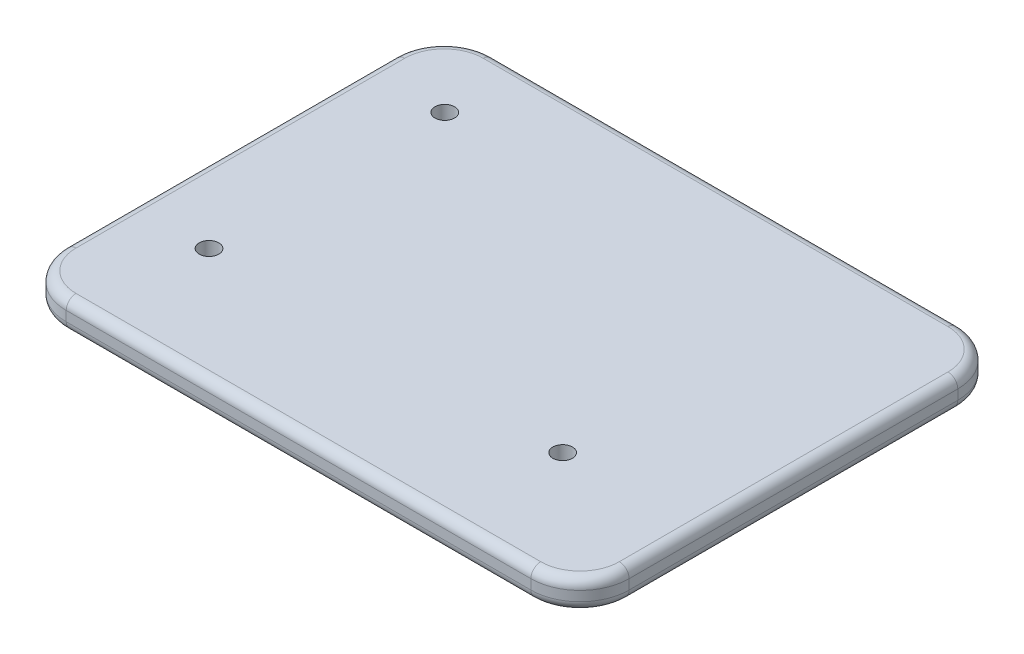
ISO-10303-21;
HEADER;
FILE_DESCRIPTION(('STEP AP214'),'2;1');
FILE_NAME('part.step','',(''),(''),'','','');
FILE_SCHEMA(('AUTOMOTIVE_DESIGN { 1 0 10303 214 1 1 1 1 }'));
ENDSEC;
DATA;
#1=APPLICATION_CONTEXT('core data for automotive mechanical design processes');
#2=APPLICATION_PROTOCOL_DEFINITION('international standard','automotive_design',2000,#1);
#3=PRODUCT_CONTEXT('',#1,'mechanical');
#4=PRODUCT('Part','Part','',(#3));
#5=PRODUCT_RELATED_PRODUCT_CATEGORY('part','',(#4));
#6=PRODUCT_DEFINITION_FORMATION('','',#4);
#7=PRODUCT_DEFINITION_CONTEXT('part definition',#1,'design');
#8=PRODUCT_DEFINITION('design','',#6,#7);
#9=PRODUCT_DEFINITION_SHAPE('','',#8);
#10=(LENGTH_UNIT() NAMED_UNIT(*) SI_UNIT(.MILLI.,.METRE.));
#11=(NAMED_UNIT(*) PLANE_ANGLE_UNIT() SI_UNIT($,.RADIAN.));
#12=(NAMED_UNIT(*) SI_UNIT($,.STERADIAN.) SOLID_ANGLE_UNIT());
#13=UNCERTAINTY_MEASURE_WITH_UNIT(LENGTH_MEASURE(1.E-05),#10,'distance_accuracy_value','');
#14=(GEOMETRIC_REPRESENTATION_CONTEXT(3) GLOBAL_UNCERTAINTY_ASSIGNED_CONTEXT((#13)) GLOBAL_UNIT_ASSIGNED_CONTEXT((#10,
#11,#12)) REPRESENTATION_CONTEXT('',''));
#15=CARTESIAN_POINT('',(0.,0.,0.));
#16=DIRECTION('',(0.,0.,1.));
#17=DIRECTION('',(1.,0.,0.));
#18=AXIS2_PLACEMENT_3D('',#15,#16,#17);
#19=CARTESIAN_POINT('',(26.655,3.,18.23));
#20=DIRECTION('',(0.,1.,0.));
#21=DIRECTION('',(0.,0.,1.));
#22=AXIS2_PLACEMENT_3D('',#19,#20,#21);
#23=PLANE('',#22);
#24=DIRECTION('',(-1.,0.,0.));
#25=VECTOR('',#24,1.);
#26=CARTESIAN_POINT('',(-20.655,3.,-19.23));
#27=LINE('',#26,#25);
#28=CARTESIAN_POINT('',(26.655,3.,-19.23));
#29=VERTEX_POINT('',#28);
#30=CARTESIAN_POINT('',(-20.655,3.,-19.23));
#31=VERTEX_POINT('',#30);
#32=EDGE_CURVE('E50',#29,#31,#27,.T.);
#33=ORIENTED_EDGE('',*,*,#32,.T.);
#34=CARTESIAN_POINT('',(-20.655,3.,-15.23));
#35=DIRECTION('',(0.,1.,0.));
#36=DIRECTION('',(0.,0.,1.));
#37=AXIS2_PLACEMENT_3D('',#34,#35,#36);
#38=CIRCLE('',#37,4.);
#39=CARTESIAN_POINT('',(-24.655,3.,-15.23));
#40=VERTEX_POINT('',#39);
#41=EDGE_CURVE('E157',#31,#40,#38,.T.);
#42=ORIENTED_EDGE('',*,*,#41,.T.);
#43=DIRECTION('',(0.,0.,1.));
#44=VECTOR('',#43,1.);
#45=CARTESIAN_POINT('',(-24.655,3.,18.23));
#46=LINE('',#45,#44);
#47=CARTESIAN_POINT('',(-24.655,3.,18.23));
#48=VERTEX_POINT('',#47);
#49=EDGE_CURVE('E181',#40,#48,#46,.T.);
#50=ORIENTED_EDGE('',*,*,#49,.T.);
#51=CARTESIAN_POINT('',(-20.655,3.,18.23));
#52=DIRECTION('',(0.,1.,0.));
#53=DIRECTION('',(0.,0.,1.));
#54=AXIS2_PLACEMENT_3D('',#51,#52,#53);
#55=CIRCLE('',#54,4.);
#56=CARTESIAN_POINT('',(-20.655,3.,22.23));
#57=VERTEX_POINT('',#56);
#58=EDGE_CURVE('E320',#48,#57,#55,.T.);
#59=ORIENTED_EDGE('',*,*,#58,.T.);
#60=DIRECTION('',(1.,0.,0.));
#61=VECTOR('',#60,1.);
#62=CARTESIAN_POINT('',(26.655,3.,22.23));
#63=LINE('',#62,#61);
#64=CARTESIAN_POINT('',(26.655,3.,22.23));
#65=VERTEX_POINT('',#64);
#66=EDGE_CURVE('E322',#57,#65,#63,.T.);
#67=ORIENTED_EDGE('',*,*,#66,.T.);
#68=CARTESIAN_POINT('',(26.655,3.,18.23));
#69=DIRECTION('',(0.,1.,0.));
#70=DIRECTION('',(0.,0.,1.));
#71=AXIS2_PLACEMENT_3D('',#68,#69,#70);
#72=CIRCLE('',#71,4.);
#73=CARTESIAN_POINT('',(30.655,3.,18.23));
#74=VERTEX_POINT('',#73);
#75=EDGE_CURVE('E324',#65,#74,#72,.T.);
#76=ORIENTED_EDGE('',*,*,#75,.T.);
#77=DIRECTION('',(0.,0.,-1.));
#78=VECTOR('',#77,1.);
#79=CARTESIAN_POINT('',(30.655,3.,-15.23));
#80=LINE('',#79,#78);
#81=CARTESIAN_POINT('',(30.655,3.,-15.23));
#82=VERTEX_POINT('',#81);
#83=EDGE_CURVE('E326',#74,#82,#80,.T.);
#84=ORIENTED_EDGE('',*,*,#83,.T.);
#85=CARTESIAN_POINT('',(26.655,3.,-15.23));
#86=DIRECTION('',(0.,1.,0.));
#87=DIRECTION('',(0.,0.,1.));
#88=AXIS2_PLACEMENT_3D('',#85,#86,#87);
#89=CIRCLE('',#88,4.);
#90=EDGE_CURVE('E55',#82,#29,#89,.T.);
#91=ORIENTED_EDGE('',*,*,#90,.T.);
#92=EDGE_LOOP('',(#33,#42,#50,#59,#67,#76,#84,#91));
#93=FACE_BOUND('',#92,.T.);
#94=CARTESIAN_POINT('',(-17.845,3.,11.5));
#95=DIRECTION('',(0.,1.,0.));
#96=DIRECTION('',(0.,0.,1.));
#97=AXIS2_PLACEMENT_3D('',#94,#95,#96);
#98=CIRCLE('',#97,1.);
#99=CARTESIAN_POINT('',(-17.845,3.,12.5));
#100=VERTEX_POINT('',#99);
#101=EDGE_CURVE('E250',#100,#100,#98,.T.);
#102=ORIENTED_EDGE('',*,*,#101,.F.);
#103=EDGE_LOOP('',(#102));
#104=FACE_BOUND('',#103,.T.);
#105=CARTESIAN_POINT('',(18.155,3.,11.5));
#106=DIRECTION('',(0.,1.,0.));
#107=DIRECTION('',(0.,0.,1.));
#108=AXIS2_PLACEMENT_3D('',#105,#106,#107);
#109=CIRCLE('',#108,1.);
#110=CARTESIAN_POINT('',(18.155,3.,12.5));
#111=VERTEX_POINT('',#110);
#112=EDGE_CURVE('E256',#111,#111,#109,.T.);
#113=ORIENTED_EDGE('',*,*,#112,.F.);
#114=EDGE_LOOP('',(#113));
#115=FACE_BOUND('',#114,.T.);
#116=CARTESIAN_POINT('',(-17.845,3.,-12.5));
#117=DIRECTION('',(0.,1.,0.));
#118=DIRECTION('',(0.,0.,1.));
#119=AXIS2_PLACEMENT_3D('',#116,#117,#118);
#120=CIRCLE('',#119,1.);
#121=CARTESIAN_POINT('',(-17.845,3.,-11.5));
#122=VERTEX_POINT('',#121);
#123=EDGE_CURVE('E242',#122,#122,#120,.T.);
#124=ORIENTED_EDGE('',*,*,#123,.F.);
#125=EDGE_LOOP('',(#124));
#126=FACE_BOUND('',#125,.T.);
#127=ADVANCED_FACE('F33',(#93,#104,#115,#126),#23,.T.);
#128=CARTESIAN_POINT('',(26.655,0.,18.23));
#129=DIRECTION('',(0.,1.,0.));
#130=DIRECTION('',(0.,0.,1.));
#131=AXIS2_PLACEMENT_3D('',#128,#129,#130);
#132=PLANE('',#131);
#133=DIRECTION('',(0.,0.,1.));
#134=VECTOR('',#133,1.);
#135=CARTESIAN_POINT('',(-24.655,0.,18.23));
#136=LINE('',#135,#134);
#137=CARTESIAN_POINT('',(-24.655,0.,18.23));
#138=VERTEX_POINT('',#137);
#139=CARTESIAN_POINT('',(-24.655,0.,-15.23));
#140=VERTEX_POINT('',#139);
#141=EDGE_CURVE('E278',#138,#140,#136,.F.);
#142=ORIENTED_EDGE('',*,*,#141,.T.);
#143=CARTESIAN_POINT('',(-20.655,0.,-15.23));
#144=DIRECTION('',(0.,1.,0.));
#145=DIRECTION('',(0.,0.,1.));
#146=AXIS2_PLACEMENT_3D('',#143,#144,#145);
#147=CIRCLE('',#146,4.);
#148=CARTESIAN_POINT('',(-20.655,0.,-19.23));
#149=VERTEX_POINT('',#148);
#150=EDGE_CURVE('E292',#140,#149,#147,.F.);
#151=ORIENTED_EDGE('',*,*,#150,.T.);
#152=DIRECTION('',(-1.,0.,0.));
#153=VECTOR('',#152,1.);
#154=CARTESIAN_POINT('',(26.655,0.,-19.23));
#155=LINE('',#154,#153);
#156=CARTESIAN_POINT('',(26.655,0.,-19.23));
#157=VERTEX_POINT('',#156);
#158=EDGE_CURVE('E290',#149,#157,#155,.F.);
#159=ORIENTED_EDGE('',*,*,#158,.T.);
#160=CARTESIAN_POINT('',(26.655,0.,-15.23));
#161=DIRECTION('',(0.,1.,0.));
#162=DIRECTION('',(0.,0.,1.));
#163=AXIS2_PLACEMENT_3D('',#160,#161,#162);
#164=CIRCLE('',#163,4.);
#165=CARTESIAN_POINT('',(30.655,0.,-15.23));
#166=VERTEX_POINT('',#165);
#167=EDGE_CURVE('E288',#157,#166,#164,.F.);
#168=ORIENTED_EDGE('',*,*,#167,.T.);
#169=DIRECTION('',(0.,0.,-1.));
#170=VECTOR('',#169,1.);
#171=CARTESIAN_POINT('',(30.655,0.,18.23));
#172=LINE('',#171,#170);
#173=CARTESIAN_POINT('',(30.655,0.,18.23));
#174=VERTEX_POINT('',#173);
#175=EDGE_CURVE('E286',#166,#174,#172,.F.);
#176=ORIENTED_EDGE('',*,*,#175,.T.);
#177=CARTESIAN_POINT('',(26.655,0.,18.23));
#178=DIRECTION('',(0.,1.,0.));
#179=DIRECTION('',(0.,0.,1.));
#180=AXIS2_PLACEMENT_3D('',#177,#178,#179);
#181=CIRCLE('',#180,4.);
#182=CARTESIAN_POINT('',(26.655,0.,22.23));
#183=VERTEX_POINT('',#182);
#184=EDGE_CURVE('E284',#174,#183,#181,.F.);
#185=ORIENTED_EDGE('',*,*,#184,.T.);
#186=DIRECTION('',(1.,0.,0.));
#187=VECTOR('',#186,1.);
#188=CARTESIAN_POINT('',(26.655,0.,22.23));
#189=LINE('',#188,#187);
#190=CARTESIAN_POINT('',(-20.655,0.,22.23));
#191=VERTEX_POINT('',#190);
#192=EDGE_CURVE('E282',#183,#191,#189,.F.);
#193=ORIENTED_EDGE('',*,*,#192,.T.);
#194=CARTESIAN_POINT('',(-20.655,0.,18.23));
#195=DIRECTION('',(0.,1.,0.));
#196=DIRECTION('',(0.,0.,1.));
#197=AXIS2_PLACEMENT_3D('',#194,#195,#196);
#198=CIRCLE('',#197,4.);
#199=EDGE_CURVE('E280',#191,#138,#198,.F.);
#200=ORIENTED_EDGE('',*,*,#199,.T.);
#201=EDGE_LOOP('',(#142,#151,#159,#168,#176,#185,#193,#200));
#202=FACE_BOUND('',#201,.T.);
#203=CARTESIAN_POINT('',(18.155,0.,11.5));
#204=DIRECTION('',(0.,1.,0.));
#205=DIRECTION('',(0.,0.,1.));
#206=AXIS2_PLACEMENT_3D('',#203,#204,#205);
#207=CIRCLE('',#206,1.);
#208=CARTESIAN_POINT('',(18.155,0.,12.5));
#209=VERTEX_POINT('',#208);
#210=EDGE_CURVE('E253',#209,#209,#207,.T.);
#211=ORIENTED_EDGE('',*,*,#210,.T.);
#212=EDGE_LOOP('',(#211));
#213=FACE_BOUND('',#212,.T.);
#214=CARTESIAN_POINT('',(-17.845,0.,11.5));
#215=DIRECTION('',(0.,1.,0.));
#216=DIRECTION('',(0.,0.,1.));
#217=AXIS2_PLACEMENT_3D('',#214,#215,#216);
#218=CIRCLE('',#217,1.);
#219=CARTESIAN_POINT('',(-17.845,0.,12.5));
#220=VERTEX_POINT('',#219);
#221=EDGE_CURVE('E247',#220,#220,#218,.T.);
#222=ORIENTED_EDGE('',*,*,#221,.T.);
#223=EDGE_LOOP('',(#222));
#224=FACE_BOUND('',#223,.T.);
#225=CARTESIAN_POINT('',(-17.845,0.,-12.5));
#226=DIRECTION('',(0.,1.,0.));
#227=DIRECTION('',(0.,0.,1.));
#228=AXIS2_PLACEMENT_3D('',#225,#226,#227);
#229=CIRCLE('',#228,1.);
#230=CARTESIAN_POINT('',(-17.845,0.,-11.5));
#231=VERTEX_POINT('',#230);
#232=EDGE_CURVE('E236',#231,#231,#229,.T.);
#233=ORIENTED_EDGE('',*,*,#232,.T.);
#234=EDGE_LOOP('',(#233));
#235=FACE_BOUND('',#234,.T.);
#236=ADVANCED_FACE('F376',(#202,#213,#224,#235),#132,.F.);
#237=CARTESIAN_POINT('',(26.655,3.,18.23));
#238=DIRECTION('',(0.,-1.,0.));
#239=DIRECTION('',(0.,0.,-1.));
#240=AXIS2_PLACEMENT_3D('',#237,#238,#239);
#241=CYLINDRICAL_SURFACE('',#240,5.);
#242=DIRECTION('',(0.,-1.,0.));
#243=VECTOR('',#242,1.);
#244=CARTESIAN_POINT('',(26.655,3.,23.23));
#245=LINE('',#244,#243);
#246=CARTESIAN_POINT('',(26.655,2.,23.23));
#247=VERTEX_POINT('',#246);
#248=CARTESIAN_POINT('',(26.655,1.,23.23));
#249=VERTEX_POINT('',#248);
#250=EDGE_CURVE('E259',#247,#249,#245,.T.);
#251=ORIENTED_EDGE('',*,*,#250,.T.);
#252=CARTESIAN_POINT('',(26.655,1.,18.23));
#253=DIRECTION('',(0.,1.,0.));
#254=DIRECTION('',(0.,0.,1.));
#255=AXIS2_PLACEMENT_3D('',#252,#253,#254);
#256=CIRCLE('',#255,5.);
#257=CARTESIAN_POINT('',(31.655,1.,18.23));
#258=VERTEX_POINT('',#257);
#259=EDGE_CURVE('E309',#249,#258,#256,.T.);
#260=ORIENTED_EDGE('',*,*,#259,.T.);
#261=DIRECTION('',(0.,-1.,0.));
#262=VECTOR('',#261,1.);
#263=CARTESIAN_POINT('',(31.655,3.,18.23));
#264=LINE('',#263,#262);
#265=CARTESIAN_POINT('',(31.655,2.,18.23));
#266=VERTEX_POINT('',#265);
#267=EDGE_CURVE('E178',#266,#258,#264,.T.);
#268=ORIENTED_EDGE('',*,*,#267,.F.);
#269=CARTESIAN_POINT('',(26.655,2.,18.23));
#270=DIRECTION('',(0.,1.,0.));
#271=DIRECTION('',(0.,0.,1.));
#272=AXIS2_PLACEMENT_3D('',#269,#270,#271);
#273=CIRCLE('',#272,5.);
#274=EDGE_CURVE('E307',#266,#247,#273,.F.);
#275=ORIENTED_EDGE('',*,*,#274,.T.);
#276=EDGE_LOOP('',(#251,#260,#268,#275));
#277=FACE_BOUND('',#276,.T.);
#278=ADVANCED_FACE('F381',(#277),#241,.T.);
#279=CARTESIAN_POINT('',(31.655,3.,18.23));
#280=DIRECTION('',(-1.,0.,0.));
#281=DIRECTION('',(0.,0.,1.));
#282=AXIS2_PLACEMENT_3D('',#279,#280,#281);
#283=PLANE('',#282);
#284=ORIENTED_EDGE('',*,*,#267,.T.);
#285=DIRECTION('',(0.,0.,-1.));
#286=VECTOR('',#285,1.);
#287=CARTESIAN_POINT('',(31.655,1.,18.23));
#288=LINE('',#287,#286);
#289=CARTESIAN_POINT('',(31.655,1.,-15.23));
#290=VERTEX_POINT('',#289);
#291=EDGE_CURVE('E305',#258,#290,#288,.T.);
#292=ORIENTED_EDGE('',*,*,#291,.T.);
#293=DIRECTION('',(0.,-1.,0.));
#294=VECTOR('',#293,1.);
#295=CARTESIAN_POINT('',(31.655,3.,-15.23));
#296=LINE('',#295,#294);
#297=CARTESIAN_POINT('',(31.655,2.,-15.23));
#298=VERTEX_POINT('',#297);
#299=EDGE_CURVE('E272',#298,#290,#296,.T.);
#300=ORIENTED_EDGE('',*,*,#299,.F.);
#301=DIRECTION('',(0.,0.,-1.));
#302=VECTOR('',#301,1.);
#303=CARTESIAN_POINT('',(31.655,2.,18.23));
#304=LINE('',#303,#302);
#305=EDGE_CURVE('E303',#298,#266,#304,.F.);
#306=ORIENTED_EDGE('',*,*,#305,.T.);
#307=EDGE_LOOP('',(#284,#292,#300,#306));
#308=FACE_BOUND('',#307,.T.);
#309=ADVANCED_FACE('F404',(#308),#283,.F.);
#310=CARTESIAN_POINT('',(26.655,3.,-15.23));
#311=DIRECTION('',(0.,-1.,0.));
#312=DIRECTION('',(0.,0.,-1.));
#313=AXIS2_PLACEMENT_3D('',#310,#311,#312);
#314=CYLINDRICAL_SURFACE('',#313,5.);
#315=ORIENTED_EDGE('',*,*,#299,.T.);
#316=CARTESIAN_POINT('',(26.655,1.,-15.23));
#317=DIRECTION('',(0.,1.,0.));
#318=DIRECTION('',(0.,0.,1.));
#319=AXIS2_PLACEMENT_3D('',#316,#317,#318);
#320=CIRCLE('',#319,5.);
#321=CARTESIAN_POINT('',(26.655,1.,-20.23));
#322=VERTEX_POINT('',#321);
#323=EDGE_CURVE('E301',#290,#322,#320,.T.);
#324=ORIENTED_EDGE('',*,*,#323,.T.);
#325=DIRECTION('',(0.,-1.,0.));
#326=VECTOR('',#325,1.);
#327=CARTESIAN_POINT('',(26.655,3.,-20.23));
#328=LINE('',#327,#326);
#329=CARTESIAN_POINT('',(26.655,2.,-20.23));
#330=VERTEX_POINT('',#329);
#331=EDGE_CURVE('E269',#330,#322,#328,.T.);
#332=ORIENTED_EDGE('',*,*,#331,.F.);
#333=CARTESIAN_POINT('',(26.655,2.,-15.23));
#334=DIRECTION('',(0.,1.,0.));
#335=DIRECTION('',(0.,0.,1.));
#336=AXIS2_PLACEMENT_3D('',#333,#334,#335);
#337=CIRCLE('',#336,5.);
#338=EDGE_CURVE('E299',#330,#298,#337,.F.);
#339=ORIENTED_EDGE('',*,*,#338,.T.);
#340=EDGE_LOOP('',(#315,#324,#332,#339));
#341=FACE_BOUND('',#340,.T.);
#342=ADVANCED_FACE('F352',(#341),#314,.T.);
#343=CARTESIAN_POINT('',(26.655,3.,-20.23));
#344=DIRECTION('',(0.,0.,1.));
#345=DIRECTION('',(1.,0.,0.));
#346=AXIS2_PLACEMENT_3D('',#343,#344,#345);
#347=PLANE('',#346);
#348=ORIENTED_EDGE('',*,*,#331,.T.);
#349=DIRECTION('',(-1.,0.,0.));
#350=VECTOR('',#349,1.);
#351=CARTESIAN_POINT('',(26.655,1.,-20.23));
#352=LINE('',#351,#350);
#353=CARTESIAN_POINT('',(-20.655,1.,-20.23));
#354=VERTEX_POINT('',#353);
#355=EDGE_CURVE('E297',#322,#354,#352,.T.);
#356=ORIENTED_EDGE('',*,*,#355,.T.);
#357=DIRECTION('',(0.,-1.,0.));
#358=VECTOR('',#357,1.);
#359=CARTESIAN_POINT('',(-20.655,3.,-20.23));
#360=LINE('',#359,#358);
#361=CARTESIAN_POINT('',(-20.655,2.,-20.23));
#362=VERTEX_POINT('',#361);
#363=EDGE_CURVE('E169',#362,#354,#360,.T.);
#364=ORIENTED_EDGE('',*,*,#363,.F.);
#365=DIRECTION('',(-1.,0.,0.));
#366=VECTOR('',#365,1.);
#367=CARTESIAN_POINT('',(26.655,2.,-20.23));
#368=LINE('',#367,#366);
#369=EDGE_CURVE('E295',#362,#330,#368,.F.);
#370=ORIENTED_EDGE('',*,*,#369,.T.);
#371=EDGE_LOOP('',(#348,#356,#364,#370));
#372=FACE_BOUND('',#371,.T.);
#373=ADVANCED_FACE('F349',(#372),#347,.F.);
#374=CARTESIAN_POINT('',(-20.655,3.,-15.23));
#375=DIRECTION('',(0.,-1.,0.));
#376=DIRECTION('',(0.,0.,-1.));
#377=AXIS2_PLACEMENT_3D('',#374,#375,#376);
#378=CYLINDRICAL_SURFACE('',#377,5.);
#379=ORIENTED_EDGE('',*,*,#363,.T.);
#380=CARTESIAN_POINT('',(-20.655,1.,-15.23));
#381=DIRECTION('',(0.,1.,0.));
#382=DIRECTION('',(0.,0.,1.));
#383=AXIS2_PLACEMENT_3D('',#380,#381,#382);
#384=CIRCLE('',#383,5.);
#385=CARTESIAN_POINT('',(-25.655,1.,-15.23));
#386=VERTEX_POINT('',#385);
#387=EDGE_CURVE('E168',#354,#386,#384,.T.);
#388=ORIENTED_EDGE('',*,*,#387,.T.);
#389=DIRECTION('',(0.,-1.,0.));
#390=VECTOR('',#389,1.);
#391=CARTESIAN_POINT('',(-25.655,3.,-15.23));
#392=LINE('',#391,#390);
#393=CARTESIAN_POINT('',(-25.655,2.,-15.23));
#394=VERTEX_POINT('',#393);
#395=EDGE_CURVE('E150',#394,#386,#392,.T.);
#396=ORIENTED_EDGE('',*,*,#395,.F.);
#397=CARTESIAN_POINT('',(-20.655,2.,-15.23));
#398=DIRECTION('',(0.,1.,0.));
#399=DIRECTION('',(0.,0.,1.));
#400=AXIS2_PLACEMENT_3D('',#397,#398,#399);
#401=CIRCLE('',#400,5.);
#402=EDGE_CURVE('E165',#394,#362,#401,.F.);
#403=ORIENTED_EDGE('',*,*,#402,.T.);
#404=EDGE_LOOP('',(#379,#388,#396,#403));
#405=FACE_BOUND('',#404,.T.);
#406=ADVANCED_FACE('F164',(#405),#378,.T.);
#407=CARTESIAN_POINT('',(-25.655,3.,-15.23));
#408=DIRECTION('',(1.,0.,0.));
#409=DIRECTION('',(0.,0.,-1.));
#410=AXIS2_PLACEMENT_3D('',#407,#408,#409);
#411=PLANE('',#410);
#412=ORIENTED_EDGE('',*,*,#395,.T.);
#413=DIRECTION('',(0.,0.,1.));
#414=VECTOR('',#413,1.);
#415=CARTESIAN_POINT('',(-25.655,1.,-15.23));
#416=LINE('',#415,#414);
#417=CARTESIAN_POINT('',(-25.655,1.,18.23));
#418=VERTEX_POINT('',#417);
#419=EDGE_CURVE('E11',#386,#418,#416,.T.);
#420=ORIENTED_EDGE('',*,*,#419,.T.);
#421=DIRECTION('',(0.,-1.,0.));
#422=VECTOR('',#421,1.);
#423=CARTESIAN_POINT('',(-25.655,3.,18.23));
#424=LINE('',#423,#422);
#425=CARTESIAN_POINT('',(-25.655,2.,18.23));
#426=VERTEX_POINT('',#425);
#427=EDGE_CURVE('E152',#426,#418,#424,.T.);
#428=ORIENTED_EDGE('',*,*,#427,.F.);
#429=DIRECTION('',(0.,0.,1.));
#430=VECTOR('',#429,1.);
#431=CARTESIAN_POINT('',(-25.655,2.,-15.23));
#432=LINE('',#431,#430);
#433=EDGE_CURVE('E42',#426,#394,#432,.F.);
#434=ORIENTED_EDGE('',*,*,#433,.T.);
#435=EDGE_LOOP('',(#412,#420,#428,#434));
#436=FACE_BOUND('',#435,.T.);
#437=ADVANCED_FACE('F149',(#436),#411,.F.);
#438=CARTESIAN_POINT('',(-20.655,3.,18.23));
#439=DIRECTION('',(0.,-1.,0.));
#440=DIRECTION('',(0.,0.,-1.));
#441=AXIS2_PLACEMENT_3D('',#438,#439,#440);
#442=CYLINDRICAL_SURFACE('',#441,5.);
#443=ORIENTED_EDGE('',*,*,#427,.T.);
#444=CARTESIAN_POINT('',(-20.655,1.,18.23));
#445=DIRECTION('',(0.,1.,0.));
#446=DIRECTION('',(0.,0.,1.));
#447=AXIS2_PLACEMENT_3D('',#444,#445,#446);
#448=CIRCLE('',#447,5.);
#449=CARTESIAN_POINT('',(-20.655,1.,23.23));
#450=VERTEX_POINT('',#449);
#451=EDGE_CURVE('E317',#418,#450,#448,.T.);
#452=ORIENTED_EDGE('',*,*,#451,.T.);
#453=DIRECTION('',(0.,-1.,0.));
#454=VECTOR('',#453,1.);
#455=CARTESIAN_POINT('',(-20.655,3.,23.23));
#456=LINE('',#455,#454);
#457=CARTESIAN_POINT('',(-20.655,2.,23.23));
#458=VERTEX_POINT('',#457);
#459=EDGE_CURVE('E264',#458,#450,#456,.T.);
#460=ORIENTED_EDGE('',*,*,#459,.F.);
#461=CARTESIAN_POINT('',(-20.655,2.,18.23));
#462=DIRECTION('',(0.,1.,0.));
#463=DIRECTION('',(0.,0.,1.));
#464=AXIS2_PLACEMENT_3D('',#461,#462,#463);
#465=CIRCLE('',#464,5.);
#466=EDGE_CURVE('E315',#458,#426,#465,.F.);
#467=ORIENTED_EDGE('',*,*,#466,.T.);
#468=EDGE_LOOP('',(#443,#452,#460,#467));
#469=FACE_BOUND('',#468,.T.);
#470=ADVANCED_FACE('F391',(#469),#442,.T.);
#471=CARTESIAN_POINT('',(-20.655,3.,23.23));
#472=DIRECTION('',(0.,0.,-1.));
#473=DIRECTION('',(-1.,0.,0.));
#474=AXIS2_PLACEMENT_3D('',#471,#472,#473);
#475=PLANE('',#474);
#476=ORIENTED_EDGE('',*,*,#459,.T.);
#477=DIRECTION('',(1.,0.,0.));
#478=VECTOR('',#477,1.);
#479=CARTESIAN_POINT('',(-20.655,1.,23.23));
#480=LINE('',#479,#478);
#481=EDGE_CURVE('E313',#450,#249,#480,.T.);
#482=ORIENTED_EDGE('',*,*,#481,.T.);
#483=ORIENTED_EDGE('',*,*,#250,.F.);
#484=DIRECTION('',(1.,0.,0.));
#485=VECTOR('',#484,1.);
#486=CARTESIAN_POINT('',(-20.655,2.,23.23));
#487=LINE('',#486,#485);
#488=EDGE_CURVE('E311',#247,#458,#487,.F.);
#489=ORIENTED_EDGE('',*,*,#488,.T.);
#490=EDGE_LOOP('',(#476,#482,#483,#489));
#491=FACE_BOUND('',#490,.T.);
#492=ADVANCED_FACE('F388',(#491),#475,.F.);
#493=CARTESIAN_POINT('',(18.155,3.,11.5));
#494=DIRECTION('',(0.,-1.,0.));
#495=DIRECTION('',(0.,0.,-1.));
#496=AXIS2_PLACEMENT_3D('',#493,#494,#495);
#497=CYLINDRICAL_SURFACE('',#496,1.);
#498=ORIENTED_EDGE('',*,*,#112,.T.);
#499=EDGE_LOOP('',(#498));
#500=FACE_BOUND('',#499,.T.);
#501=ORIENTED_EDGE('',*,*,#210,.F.);
#502=EDGE_LOOP('',(#501));
#503=FACE_BOUND('',#502,.T.);
#504=ADVANCED_FACE('F385',(#500,#503),#497,.F.);
#505=CARTESIAN_POINT('',(-17.845,3.,11.5));
#506=DIRECTION('',(0.,-1.,0.));
#507=DIRECTION('',(0.,0.,-1.));
#508=AXIS2_PLACEMENT_3D('',#505,#506,#507);
#509=CYLINDRICAL_SURFACE('',#508,1.);
#510=ORIENTED_EDGE('',*,*,#101,.T.);
#511=EDGE_LOOP('',(#510));
#512=FACE_BOUND('',#511,.T.);
#513=ORIENTED_EDGE('',*,*,#221,.F.);
#514=EDGE_LOOP('',(#513));
#515=FACE_BOUND('',#514,.T.);
#516=ADVANCED_FACE('F549',(#512,#515),#509,.F.);
#517=CARTESIAN_POINT('',(-17.845,3.,-12.5));
#518=DIRECTION('',(0.,-1.,0.));
#519=DIRECTION('',(0.,0.,-1.));
#520=AXIS2_PLACEMENT_3D('',#517,#518,#519);
#521=CYLINDRICAL_SURFACE('',#520,1.);
#522=ORIENTED_EDGE('',*,*,#123,.T.);
#523=EDGE_LOOP('',(#522));
#524=FACE_BOUND('',#523,.T.);
#525=ORIENTED_EDGE('',*,*,#232,.F.);
#526=EDGE_LOOP('',(#525));
#527=FACE_BOUND('',#526,.T.);
#528=ADVANCED_FACE('F440',(#524,#527),#521,.F.);
#529=CARTESIAN_POINT('',(26.655,1.,18.23));
#530=DIRECTION('',(0.,1.,0.));
#531=DIRECTION('',(0.,0.,1.));
#532=AXIS2_PLACEMENT_3D('',#529,#530,#531);
#533=TOROIDAL_SURFACE('',#532,4.,1.);
#534=CARTESIAN_POINT('',(26.655,1.,22.23));
#535=DIRECTION('',(-1.,0.,0.));
#536=DIRECTION('',(0.,0.,1.));
#537=AXIS2_PLACEMENT_3D('',#534,#535,#536);
#538=CIRCLE('',#537,1.);
#539=EDGE_CURVE('E229',#183,#249,#538,.T.);
#540=ORIENTED_EDGE('',*,*,#539,.F.);
#541=ORIENTED_EDGE('',*,*,#184,.F.);
#542=CARTESIAN_POINT('',(30.655,1.,18.23));
#543=DIRECTION('',(0.,0.,-1.));
#544=DIRECTION('',(-1.,0.,0.));
#545=AXIS2_PLACEMENT_3D('',#542,#543,#544);
#546=CIRCLE('',#545,1.);
#547=EDGE_CURVE('E186',#258,#174,#546,.T.);
#548=ORIENTED_EDGE('',*,*,#547,.F.);
#549=ORIENTED_EDGE('',*,*,#259,.F.);
#550=EDGE_LOOP('',(#540,#541,#548,#549));
#551=FACE_BOUND('',#550,.T.);
#552=ADVANCED_FACE('F415',(#551),#533,.T.);
#553=CARTESIAN_POINT('',(30.655,1.,18.23));
#554=DIRECTION('',(0.,0.,-1.));
#555=DIRECTION('',(-1.,0.,0.));
#556=AXIS2_PLACEMENT_3D('',#553,#554,#555);
#557=CYLINDRICAL_SURFACE('',#556,1.);
#558=ORIENTED_EDGE('',*,*,#547,.T.);
#559=ORIENTED_EDGE('',*,*,#175,.F.);
#560=CARTESIAN_POINT('',(30.655,1.,-15.23));
#561=DIRECTION('',(0.,0.,-1.));
#562=DIRECTION('',(-1.,0.,0.));
#563=AXIS2_PLACEMENT_3D('',#560,#561,#562);
#564=CIRCLE('',#563,1.);
#565=EDGE_CURVE('E227',#290,#166,#564,.T.);
#566=ORIENTED_EDGE('',*,*,#565,.F.);
#567=ORIENTED_EDGE('',*,*,#291,.F.);
#568=EDGE_LOOP('',(#558,#559,#566,#567));
#569=FACE_BOUND('',#568,.T.);
#570=ADVANCED_FACE('F417',(#569),#557,.T.);
#571=CARTESIAN_POINT('',(-20.655,1.,22.23));
#572=DIRECTION('',(1.,0.,0.));
#573=DIRECTION('',(0.,0.,-1.));
#574=AXIS2_PLACEMENT_3D('',#571,#572,#573);
#575=CYLINDRICAL_SURFACE('',#574,1.);
#576=ORIENTED_EDGE('',*,*,#539,.T.);
#577=ORIENTED_EDGE('',*,*,#481,.F.);
#578=CARTESIAN_POINT('',(-20.655,1.,22.23));
#579=DIRECTION('',(-1.,0.,0.));
#580=DIRECTION('',(0.,0.,1.));
#581=AXIS2_PLACEMENT_3D('',#578,#579,#580);
#582=CIRCLE('',#581,1.);
#583=EDGE_CURVE('E224',#191,#450,#582,.T.);
#584=ORIENTED_EDGE('',*,*,#583,.F.);
#585=ORIENTED_EDGE('',*,*,#192,.F.);
#586=EDGE_LOOP('',(#576,#577,#584,#585));
#587=FACE_BOUND('',#586,.T.);
#588=ADVANCED_FACE('F427',(#587),#575,.T.);
#589=CARTESIAN_POINT('',(26.655,1.,-15.23));
#590=DIRECTION('',(0.,1.,0.));
#591=DIRECTION('',(0.,0.,1.));
#592=AXIS2_PLACEMENT_3D('',#589,#590,#591);
#593=TOROIDAL_SURFACE('',#592,4.,1.);
#594=ORIENTED_EDGE('',*,*,#565,.T.);
#595=ORIENTED_EDGE('',*,*,#167,.F.);
#596=CARTESIAN_POINT('',(26.655,1.,-19.23));
#597=DIRECTION('',(-1.,0.,0.));
#598=DIRECTION('',(0.,0.,1.));
#599=AXIS2_PLACEMENT_3D('',#596,#597,#598);
#600=CIRCLE('',#599,1.);
#601=EDGE_CURVE('E221',#322,#157,#600,.T.);
#602=ORIENTED_EDGE('',*,*,#601,.F.);
#603=ORIENTED_EDGE('',*,*,#323,.F.);
#604=EDGE_LOOP('',(#594,#595,#602,#603));
#605=FACE_BOUND('',#604,.T.);
#606=ADVANCED_FACE('F357',(#605),#593,.T.);
#607=CARTESIAN_POINT('',(-20.655,1.,18.23));
#608=DIRECTION('',(0.,1.,0.));
#609=DIRECTION('',(0.,0.,1.));
#610=AXIS2_PLACEMENT_3D('',#607,#608,#609);
#611=TOROIDAL_SURFACE('',#610,4.,1.);
#612=ORIENTED_EDGE('',*,*,#583,.T.);
#613=ORIENTED_EDGE('',*,*,#451,.F.);
#614=CARTESIAN_POINT('',(-24.655,1.,18.23));
#615=DIRECTION('',(0.,0.,-1.));
#616=DIRECTION('',(-1.,0.,0.));
#617=AXIS2_PLACEMENT_3D('',#614,#615,#616);
#618=CIRCLE('',#617,1.);
#619=EDGE_CURVE('E216',#138,#418,#618,.T.);
#620=ORIENTED_EDGE('',*,*,#619,.F.);
#621=ORIENTED_EDGE('',*,*,#199,.F.);
#622=EDGE_LOOP('',(#612,#613,#620,#621));
#623=FACE_BOUND('',#622,.T.);
#624=ADVANCED_FACE('F424',(#623),#611,.T.);
#625=CARTESIAN_POINT('',(26.655,1.,-19.23));
#626=DIRECTION('',(-1.,0.,0.));
#627=DIRECTION('',(0.,0.,1.));
#628=AXIS2_PLACEMENT_3D('',#625,#626,#627);
#629=CYLINDRICAL_SURFACE('',#628,1.);
#630=ORIENTED_EDGE('',*,*,#601,.T.);
#631=ORIENTED_EDGE('',*,*,#158,.F.);
#632=CARTESIAN_POINT('',(-20.655,1.,-19.23));
#633=DIRECTION('',(-1.,0.,0.));
#634=DIRECTION('',(0.,0.,1.));
#635=AXIS2_PLACEMENT_3D('',#632,#633,#634);
#636=CIRCLE('',#635,1.);
#637=EDGE_CURVE('E210',#354,#149,#636,.T.);
#638=ORIENTED_EDGE('',*,*,#637,.F.);
#639=ORIENTED_EDGE('',*,*,#355,.F.);
#640=EDGE_LOOP('',(#630,#631,#638,#639));
#641=FACE_BOUND('',#640,.T.);
#642=ADVANCED_FACE('F363',(#641),#629,.T.);
#643=CARTESIAN_POINT('',(-24.655,1.,-15.23));
#644=DIRECTION('',(0.,0.,1.));
#645=DIRECTION('',(1.,0.,0.));
#646=AXIS2_PLACEMENT_3D('',#643,#644,#645);
#647=CYLINDRICAL_SURFACE('',#646,1.);
#648=ORIENTED_EDGE('',*,*,#619,.T.);
#649=ORIENTED_EDGE('',*,*,#419,.F.);
#650=CARTESIAN_POINT('',(-24.655,1.,-15.23));
#651=DIRECTION('',(0.,0.,-1.));
#652=DIRECTION('',(-1.,0.,0.));
#653=AXIS2_PLACEMENT_3D('',#650,#651,#652);
#654=CIRCLE('',#653,1.);
#655=EDGE_CURVE('E205',#140,#386,#654,.T.);
#656=ORIENTED_EDGE('',*,*,#655,.F.);
#657=ORIENTED_EDGE('',*,*,#141,.F.);
#658=EDGE_LOOP('',(#648,#649,#656,#657));
#659=FACE_BOUND('',#658,.T.);
#660=ADVANCED_FACE('F366',(#659),#647,.T.);
#661=CARTESIAN_POINT('',(-20.655,1.,-15.23));
#662=DIRECTION('',(0.,1.,0.));
#663=DIRECTION('',(0.,0.,1.));
#664=AXIS2_PLACEMENT_3D('',#661,#662,#663);
#665=TOROIDAL_SURFACE('',#664,4.,1.);
#666=ORIENTED_EDGE('',*,*,#637,.T.);
#667=ORIENTED_EDGE('',*,*,#150,.F.);
#668=ORIENTED_EDGE('',*,*,#655,.T.);
#669=ORIENTED_EDGE('',*,*,#387,.F.);
#670=EDGE_LOOP('',(#666,#667,#668,#669));
#671=FACE_BOUND('',#670,.T.);
#672=ADVANCED_FACE('F364',(#671),#665,.T.);
#673=CARTESIAN_POINT('',(26.655,2.,18.23));
#674=DIRECTION('',(0.,1.,0.));
#675=DIRECTION('',(0.,0.,1.));
#676=AXIS2_PLACEMENT_3D('',#673,#674,#675);
#677=TOROIDAL_SURFACE('',#676,4.,1.);
#678=CARTESIAN_POINT('',(26.655,2.,22.23));
#679=DIRECTION('',(-1.,0.,0.));
#680=DIRECTION('',(0.,0.,1.));
#681=AXIS2_PLACEMENT_3D('',#678,#679,#680);
#682=CIRCLE('',#681,1.);
#683=EDGE_CURVE('E198',#247,#65,#682,.T.);
#684=ORIENTED_EDGE('',*,*,#683,.F.);
#685=ORIENTED_EDGE('',*,*,#274,.F.);
#686=CARTESIAN_POINT('',(30.655,2.,18.23));
#687=DIRECTION('',(0.,0.,-1.));
#688=DIRECTION('',(-1.,0.,0.));
#689=AXIS2_PLACEMENT_3D('',#686,#687,#688);
#690=CIRCLE('',#689,1.);
#691=EDGE_CURVE('E37',#74,#266,#690,.T.);
#692=ORIENTED_EDGE('',*,*,#691,.F.);
#693=ORIENTED_EDGE('',*,*,#75,.F.);
#694=EDGE_LOOP('',(#684,#685,#692,#693));
#695=FACE_BOUND('',#694,.T.);
#696=ADVANCED_FACE('F35',(#695),#677,.T.);
#697=CARTESIAN_POINT('',(30.655,2.,18.23));
#698=DIRECTION('',(0.,0.,1.));
#699=DIRECTION('',(1.,0.,0.));
#700=AXIS2_PLACEMENT_3D('',#697,#698,#699);
#701=CYLINDRICAL_SURFACE('',#700,1.);
#702=ORIENTED_EDGE('',*,*,#691,.T.);
#703=ORIENTED_EDGE('',*,*,#305,.F.);
#704=CARTESIAN_POINT('',(30.655,2.,-15.23));
#705=DIRECTION('',(0.,0.,-1.));
#706=DIRECTION('',(-1.,0.,0.));
#707=AXIS2_PLACEMENT_3D('',#704,#705,#706);
#708=CIRCLE('',#707,1.);
#709=EDGE_CURVE('E196',#82,#298,#708,.T.);
#710=ORIENTED_EDGE('',*,*,#709,.F.);
#711=ORIENTED_EDGE('',*,*,#83,.F.);
#712=EDGE_LOOP('',(#702,#703,#710,#711));
#713=FACE_BOUND('',#712,.T.);
#714=ADVANCED_FACE('F341',(#713),#701,.T.);
#715=CARTESIAN_POINT('',(26.655,2.,22.23));
#716=DIRECTION('',(-1.,0.,0.));
#717=DIRECTION('',(0.,0.,1.));
#718=AXIS2_PLACEMENT_3D('',#715,#716,#717);
#719=CYLINDRICAL_SURFACE('',#718,1.);
#720=ORIENTED_EDGE('',*,*,#683,.T.);
#721=ORIENTED_EDGE('',*,*,#66,.F.);
#722=CARTESIAN_POINT('',(-20.655,2.,22.23));
#723=DIRECTION('',(-1.,0.,0.));
#724=DIRECTION('',(0.,0.,1.));
#725=AXIS2_PLACEMENT_3D('',#722,#723,#724);
#726=CIRCLE('',#725,1.);
#727=EDGE_CURVE('E193',#458,#57,#726,.T.);
#728=ORIENTED_EDGE('',*,*,#727,.F.);
#729=ORIENTED_EDGE('',*,*,#488,.F.);
#730=EDGE_LOOP('',(#720,#721,#728,#729));
#731=FACE_BOUND('',#730,.T.);
#732=ADVANCED_FACE('F336',(#731),#719,.T.);
#733=CARTESIAN_POINT('',(26.655,2.,-15.23));
#734=DIRECTION('',(0.,1.,0.));
#735=DIRECTION('',(0.,0.,1.));
#736=AXIS2_PLACEMENT_3D('',#733,#734,#735);
#737=TOROIDAL_SURFACE('',#736,4.,1.);
#738=ORIENTED_EDGE('',*,*,#709,.T.);
#739=ORIENTED_EDGE('',*,*,#338,.F.);
#740=CARTESIAN_POINT('',(26.655,2.,-19.23));
#741=DIRECTION('',(-1.,0.,0.));
#742=DIRECTION('',(0.,0.,1.));
#743=AXIS2_PLACEMENT_3D('',#740,#741,#742);
#744=CIRCLE('',#743,1.);
#745=EDGE_CURVE('E190',#29,#330,#744,.T.);
#746=ORIENTED_EDGE('',*,*,#745,.F.);
#747=ORIENTED_EDGE('',*,*,#90,.F.);
#748=EDGE_LOOP('',(#738,#739,#746,#747));
#749=FACE_BOUND('',#748,.T.);
#750=ADVANCED_FACE('F344',(#749),#737,.T.);
#751=CARTESIAN_POINT('',(-20.655,2.,18.23));
#752=DIRECTION('',(0.,1.,0.));
#753=DIRECTION('',(0.,0.,1.));
#754=AXIS2_PLACEMENT_3D('',#751,#752,#753);
#755=TOROIDAL_SURFACE('',#754,4.,1.);
#756=ORIENTED_EDGE('',*,*,#727,.T.);
#757=ORIENTED_EDGE('',*,*,#58,.F.);
#758=CARTESIAN_POINT('',(-24.655,2.,18.23));
#759=DIRECTION('',(0.,0.,-1.));
#760=DIRECTION('',(-1.,0.,0.));
#761=AXIS2_PLACEMENT_3D('',#758,#759,#760);
#762=CIRCLE('',#761,1.);
#763=EDGE_CURVE('E183',#426,#48,#762,.T.);
#764=ORIENTED_EDGE('',*,*,#763,.F.);
#765=ORIENTED_EDGE('',*,*,#466,.F.);
#766=EDGE_LOOP('',(#756,#757,#764,#765));
#767=FACE_BOUND('',#766,.T.);
#768=ADVANCED_FACE('F333',(#767),#755,.T.);
#769=CARTESIAN_POINT('',(26.655,2.,-19.23));
#770=DIRECTION('',(1.,0.,0.));
#771=DIRECTION('',(0.,0.,-1.));
#772=AXIS2_PLACEMENT_3D('',#769,#770,#771);
#773=CYLINDRICAL_SURFACE('',#772,1.);
#774=ORIENTED_EDGE('',*,*,#745,.T.);
#775=ORIENTED_EDGE('',*,*,#369,.F.);
#776=CARTESIAN_POINT('',(-20.655,2.,-19.23));
#777=DIRECTION('',(-1.,0.,0.));
#778=DIRECTION('',(0.,0.,1.));
#779=AXIS2_PLACEMENT_3D('',#776,#777,#778);
#780=CIRCLE('',#779,1.);
#781=EDGE_CURVE('E176',#31,#362,#780,.T.);
#782=ORIENTED_EDGE('',*,*,#781,.F.);
#783=ORIENTED_EDGE('',*,*,#32,.F.);
#784=EDGE_LOOP('',(#774,#775,#782,#783));
#785=FACE_BOUND('',#784,.T.);
#786=ADVANCED_FACE('F346',(#785),#773,.T.);
#787=CARTESIAN_POINT('',(-24.655,2.,18.23));
#788=DIRECTION('',(0.,0.,-1.));
#789=DIRECTION('',(-1.,0.,0.));
#790=AXIS2_PLACEMENT_3D('',#787,#788,#789);
#791=CYLINDRICAL_SURFACE('',#790,1.);
#792=ORIENTED_EDGE('',*,*,#763,.T.);
#793=ORIENTED_EDGE('',*,*,#49,.F.);
#794=CARTESIAN_POINT('',(-24.655,2.,-15.23));
#795=DIRECTION('',(0.,0.,-1.));
#796=DIRECTION('',(-1.,0.,0.));
#797=AXIS2_PLACEMENT_3D('',#794,#795,#796);
#798=CIRCLE('',#797,1.);
#799=EDGE_CURVE('E174',#394,#40,#798,.T.);
#800=ORIENTED_EDGE('',*,*,#799,.F.);
#801=ORIENTED_EDGE('',*,*,#433,.F.);
#802=EDGE_LOOP('',(#792,#793,#800,#801));
#803=FACE_BOUND('',#802,.T.);
#804=ADVANCED_FACE('F180',(#803),#791,.T.);
#805=CARTESIAN_POINT('',(-20.655,2.,-15.23));
#806=DIRECTION('',(0.,1.,0.));
#807=DIRECTION('',(0.,0.,1.));
#808=AXIS2_PLACEMENT_3D('',#805,#806,#807);
#809=TOROIDAL_SURFACE('',#808,4.,1.);
#810=ORIENTED_EDGE('',*,*,#781,.T.);
#811=ORIENTED_EDGE('',*,*,#402,.F.);
#812=ORIENTED_EDGE('',*,*,#799,.T.);
#813=ORIENTED_EDGE('',*,*,#41,.F.);
#814=EDGE_LOOP('',(#810,#811,#812,#813));
#815=FACE_BOUND('',#814,.T.);
#816=ADVANCED_FACE('F172',(#815),#809,.T.);
#817=CLOSED_SHELL('',(#127,#236,#278,#309,#342,#373,#406,#437,#470,#492,#504,#516,#528,#552,
#570,#588,#606,#624,#642,#660,#672,#696,#714,#732,#750,#768,#786,#804,#816));
#818=MANIFOLD_SOLID_BREP('B2',#817);
#819=ADVANCED_BREP_SHAPE_REPRESENTATION('',(#18,#818),#14);
#820=SHAPE_DEFINITION_REPRESENTATION(#9,#819);
ENDSEC;
END-ISO-10303-21;
